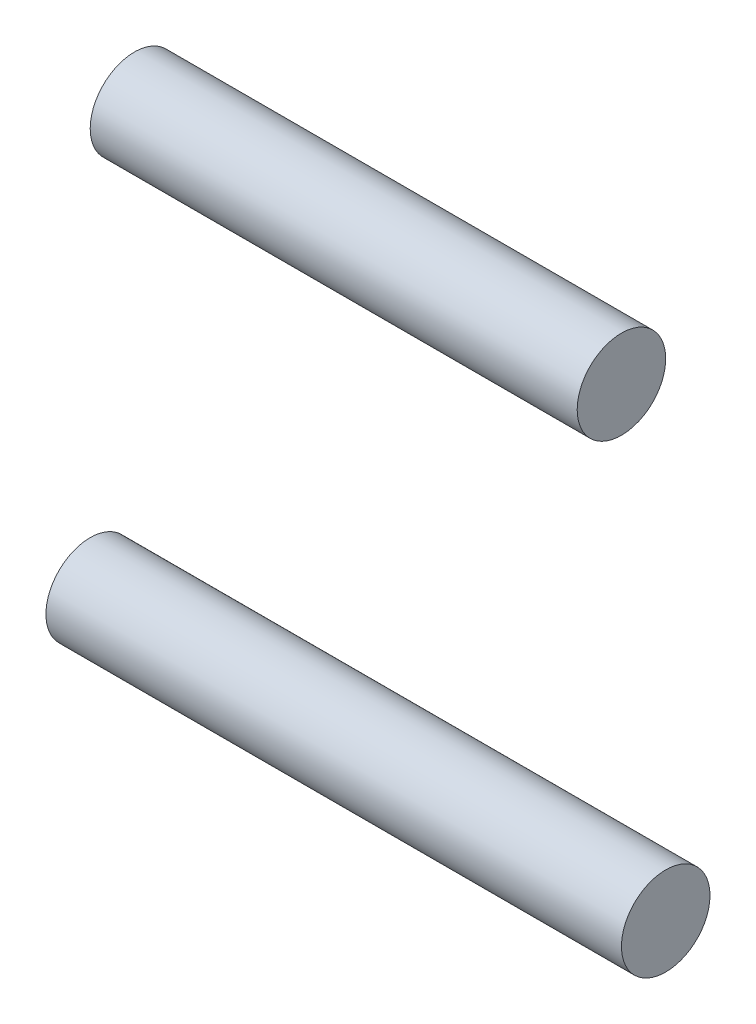
ISO-10303-21;
HEADER;
FILE_DESCRIPTION(('STEP AP214'),'2;1');
FILE_NAME('part.step','',(''),(''),'','','');
FILE_SCHEMA(('AUTOMOTIVE_DESIGN { 1 0 10303 214 1 1 1 1 }'));
ENDSEC;
DATA;
#1=APPLICATION_CONTEXT('core data for automotive mechanical design processes');
#2=APPLICATION_PROTOCOL_DEFINITION('international standard','automotive_design',2000,#1);
#3=PRODUCT_CONTEXT('',#1,'mechanical');
#4=PRODUCT('Part','Part','',(#3));
#5=PRODUCT_RELATED_PRODUCT_CATEGORY('part','',(#4));
#6=PRODUCT_DEFINITION_FORMATION('','',#4);
#7=PRODUCT_DEFINITION_CONTEXT('part definition',#1,'design');
#8=PRODUCT_DEFINITION('design','',#6,#7);
#9=PRODUCT_DEFINITION_SHAPE('','',#8);
#10=(LENGTH_UNIT() NAMED_UNIT(*) SI_UNIT(.MILLI.,.METRE.));
#11=(NAMED_UNIT(*) PLANE_ANGLE_UNIT() SI_UNIT($,.RADIAN.));
#12=(NAMED_UNIT(*) SI_UNIT($,.STERADIAN.) SOLID_ANGLE_UNIT());
#13=UNCERTAINTY_MEASURE_WITH_UNIT(LENGTH_MEASURE(1.E-05),#10,'distance_accuracy_value','');
#14=(GEOMETRIC_REPRESENTATION_CONTEXT(3) GLOBAL_UNCERTAINTY_ASSIGNED_CONTEXT((#13)) GLOBAL_UNIT_ASSIGNED_CONTEXT((#10,
#11,#12)) REPRESENTATION_CONTEXT('',''));
#15=CARTESIAN_POINT('',(0.,0.,0.));
#16=DIRECTION('',(0.,0.,1.));
#17=DIRECTION('',(1.,0.,0.));
#18=AXIS2_PLACEMENT_3D('',#15,#16,#17);
#19=CARTESIAN_POINT('',(45.,0.,0.));
#20=DIRECTION('',(1.,0.,0.));
#21=DIRECTION('',(0.,0.,-1.));
#22=AXIS2_PLACEMENT_3D('',#19,#20,#21);
#23=PLANE('',#22);
#24=CARTESIAN_POINT('',(45.,0.,0.));
#25=DIRECTION('',(1.,0.,0.));
#26=DIRECTION('',(0.,0.,-1.));
#27=AXIS2_PLACEMENT_3D('',#24,#25,#26);
#28=CIRCLE('',#27,10.);
#29=CARTESIAN_POINT('',(45.,0.,-10.));
#30=VERTEX_POINT('',#29);
#31=EDGE_CURVE('E60',#30,#30,#28,.T.);
#32=ORIENTED_EDGE('',*,*,#31,.F.);
#33=EDGE_LOOP('',(#32));
#34=FACE_BOUND('',#33,.T.);
#35=ADVANCED_FACE('F54',(#34),#23,.F.);
#36=CARTESIAN_POINT('',(175.,0.,0.));
#37=DIRECTION('',(1.,0.,0.));
#38=DIRECTION('',(0.,0.,-1.));
#39=AXIS2_PLACEMENT_3D('',#36,#37,#38);
#40=PLANE('',#39);
#41=CARTESIAN_POINT('',(175.,0.,0.));
#42=DIRECTION('',(1.,0.,0.));
#43=DIRECTION('',(0.,0.,-1.));
#44=AXIS2_PLACEMENT_3D('',#41,#42,#43);
#45=CIRCLE('',#44,10.);
#46=CARTESIAN_POINT('',(175.,0.,-10.));
#47=VERTEX_POINT('',#46);
#48=EDGE_CURVE('E12',#47,#47,#45,.T.);
#49=ORIENTED_EDGE('',*,*,#48,.T.);
#50=EDGE_LOOP('',(#49));
#51=FACE_BOUND('',#50,.T.);
#52=ADVANCED_FACE('F69',(#51),#40,.T.);
#53=CARTESIAN_POINT('',(45.,0.,0.));
#54=DIRECTION('',(1.,0.,0.));
#55=DIRECTION('',(0.,0.,-1.));
#56=AXIS2_PLACEMENT_3D('',#53,#54,#55);
#57=CYLINDRICAL_SURFACE('',#56,10.);
#58=ORIENTED_EDGE('',*,*,#48,.F.);
#59=EDGE_LOOP('',(#58));
#60=FACE_BOUND('',#59,.T.);
#61=ORIENTED_EDGE('',*,*,#31,.T.);
#62=EDGE_LOOP('',(#61));
#63=FACE_BOUND('',#62,.T.);
#64=ADVANCED_FACE('F66',(#60,#63),#57,.T.);
#65=CLOSED_SHELL('',(#35,#52,#64));
#66=MANIFOLD_SOLID_BREP('B2',#65);
#67=CARTESIAN_POINT('',(165.,100.,0.));
#68=DIRECTION('',(-1.,0.,0.));
#69=DIRECTION('',(0.,0.,1.));
#70=AXIS2_PLACEMENT_3D('',#67,#68,#69);
#71=PLANE('',#70);
#72=CARTESIAN_POINT('',(165.,100.,0.));
#73=DIRECTION('',(-1.,0.,0.));
#74=DIRECTION('',(0.,0.,1.));
#75=AXIS2_PLACEMENT_3D('',#72,#73,#74);
#76=CIRCLE('',#75,10.);
#77=CARTESIAN_POINT('',(165.,100.,10.));
#78=VERTEX_POINT('',#77);
#79=EDGE_CURVE('E100',#78,#78,#76,.T.);
#80=ORIENTED_EDGE('',*,*,#79,.F.);
#81=EDGE_LOOP('',(#80));
#82=FACE_BOUND('',#81,.T.);
#83=ADVANCED_FACE('F94',(#82),#71,.F.);
#84=CARTESIAN_POINT('',(55.,100.,0.));
#85=DIRECTION('',(-1.,0.,0.));
#86=DIRECTION('',(0.,0.,1.));
#87=AXIS2_PLACEMENT_3D('',#84,#85,#86);
#88=PLANE('',#87);
#89=CARTESIAN_POINT('',(55.,100.,0.));
#90=DIRECTION('',(-1.,0.,0.));
#91=DIRECTION('',(0.,0.,1.));
#92=AXIS2_PLACEMENT_3D('',#89,#90,#91);
#93=CIRCLE('',#92,10.);
#94=CARTESIAN_POINT('',(55.,100.,10.));
#95=VERTEX_POINT('',#94);
#96=EDGE_CURVE('E53',#95,#95,#93,.T.);
#97=ORIENTED_EDGE('',*,*,#96,.T.);
#98=EDGE_LOOP('',(#97));
#99=FACE_BOUND('',#98,.T.);
#100=ADVANCED_FACE('F109',(#99),#88,.T.);
#101=CARTESIAN_POINT('',(165.,100.,0.));
#102=DIRECTION('',(-1.,0.,0.));
#103=DIRECTION('',(0.,0.,1.));
#104=AXIS2_PLACEMENT_3D('',#101,#102,#103);
#105=CYLINDRICAL_SURFACE('',#104,10.);
#106=ORIENTED_EDGE('',*,*,#96,.F.);
#107=EDGE_LOOP('',(#106));
#108=FACE_BOUND('',#107,.T.);
#109=ORIENTED_EDGE('',*,*,#79,.T.);
#110=EDGE_LOOP('',(#109));
#111=FACE_BOUND('',#110,.T.);
#112=ADVANCED_FACE('F106',(#108,#111),#105,.T.);
#113=CLOSED_SHELL('',(#83,#100,#112));
#114=MANIFOLD_SOLID_BREP('B7',#113);
#115=ADVANCED_BREP_SHAPE_REPRESENTATION('',(#18,#66,#114),#14);
#116=SHAPE_DEFINITION_REPRESENTATION(#9,#115);
ENDSEC;
END-ISO-10303-21;
